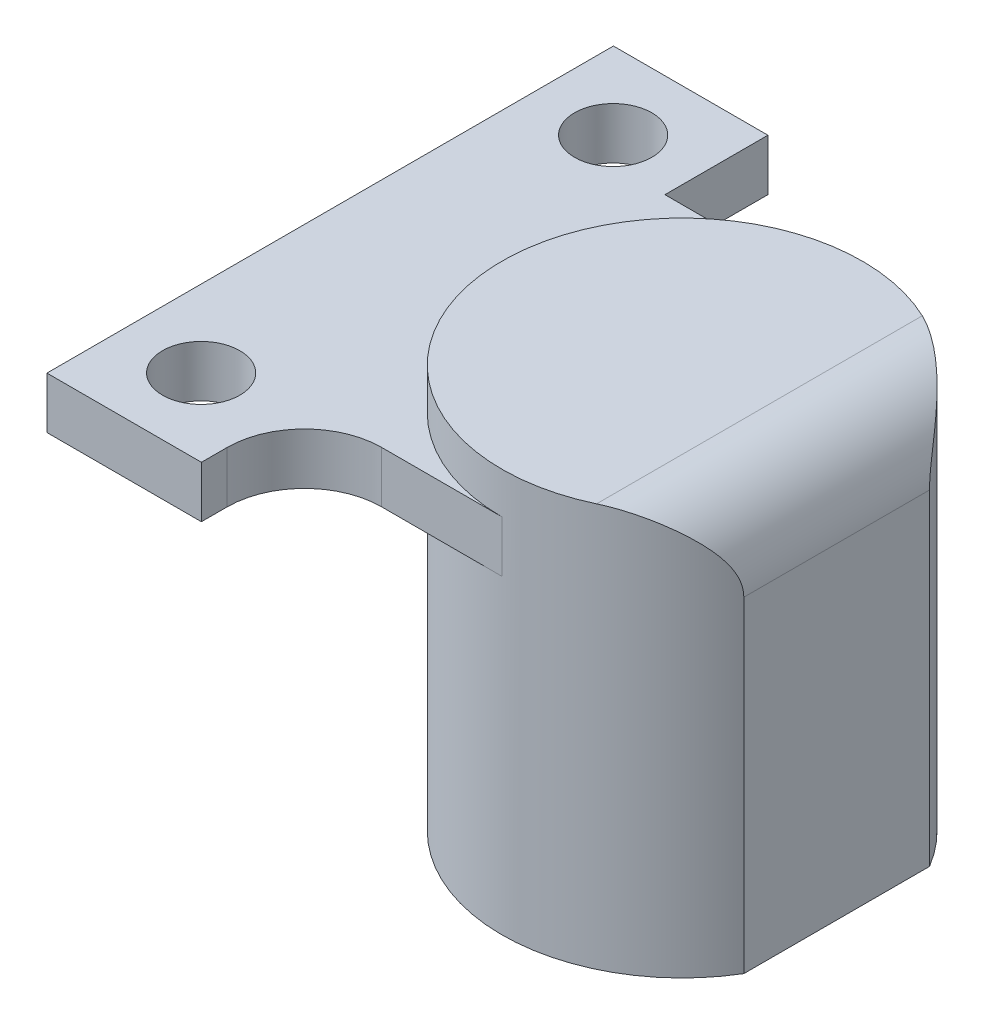
ISO-10303-21;
HEADER;
FILE_DESCRIPTION(('STEP AP214'),'2;1');
FILE_NAME('part.step','',(''),(''),'','','');
FILE_SCHEMA(('AUTOMOTIVE_DESIGN { 1 0 10303 214 1 1 1 1 }'));
ENDSEC;
DATA;
#1=APPLICATION_CONTEXT('core data for automotive mechanical design processes');
#2=APPLICATION_PROTOCOL_DEFINITION('international standard','automotive_design',2000,#1);
#3=PRODUCT_CONTEXT('',#1,'mechanical');
#4=PRODUCT('Part','Part','',(#3));
#5=PRODUCT_RELATED_PRODUCT_CATEGORY('part','',(#4));
#6=PRODUCT_DEFINITION_FORMATION('','',#4);
#7=PRODUCT_DEFINITION_CONTEXT('part definition',#1,'design');
#8=PRODUCT_DEFINITION('design','',#6,#7);
#9=PRODUCT_DEFINITION_SHAPE('','',#8);
#10=(LENGTH_UNIT() NAMED_UNIT(*) SI_UNIT(.MILLI.,.METRE.));
#11=(NAMED_UNIT(*) PLANE_ANGLE_UNIT() SI_UNIT($,.RADIAN.));
#12=(NAMED_UNIT(*) SI_UNIT($,.STERADIAN.) SOLID_ANGLE_UNIT());
#13=UNCERTAINTY_MEASURE_WITH_UNIT(LENGTH_MEASURE(1.E-05),#10,'distance_accuracy_value','');
#14=(GEOMETRIC_REPRESENTATION_CONTEXT(3) GLOBAL_UNCERTAINTY_ASSIGNED_CONTEXT((#13)) GLOBAL_UNIT_ASSIGNED_CONTEXT((#10,
#11,#12)) REPRESENTATION_CONTEXT('',''));
#15=CARTESIAN_POINT('',(0.,0.,0.));
#16=DIRECTION('',(0.,0.,1.));
#17=DIRECTION('',(1.,0.,0.));
#18=AXIS2_PLACEMENT_3D('',#15,#16,#17);
#19=CARTESIAN_POINT('',(3.00000000000001,12.66,-3.60555127546398));
#20=DIRECTION('',(0.,0.,-1.));
#21=DIRECTION('',(-1.,0.,0.));
#22=AXIS2_PLACEMENT_3D('',#19,#20,#21);
#23=CYLINDRICAL_SURFACE('',#22,3.);
#24=DIRECTION('',(0.,0.,1.));
#25=VECTOR('',#24,1.);
#26=CARTESIAN_POINT('',(6.00000000000002,12.66,-3.60555127546396));
#27=LINE('',#26,#25);
#28=CARTESIAN_POINT('',(6.00000000000002,12.66,-3.60555127546396));
#29=VERTEX_POINT('',#28);
#30=CARTESIAN_POINT('',(5.99999999999999,12.66,3.60555127546401));
#31=VERTEX_POINT('',#30);
#32=EDGE_CURVE('E173',#29,#31,#27,.T.);
#33=ORIENTED_EDGE('',*,*,#32,.F.);
#34=CARTESIAN_POINT('',(3.00000000000003,15.66,-6.32455532033675));
#35=CARTESIAN_POINT('',(3.09493653043601,15.6600046677572,-6.27954539564103));
#36=CARTESIAN_POINT('',(3.18878959130431,15.6554951840768,-6.23238730411597));
#37=CARTESIAN_POINT('',(3.3735772382066,15.6380919790941,-6.134315643579));
#38=CARTESIAN_POINT('',(3.46451523908464,15.6252084745325,-6.08340671779952));
#39=CARTESIAN_POINT('',(3.64220443721596,15.591839265947,-5.97870486558365));
#40=CARTESIAN_POINT('',(3.72898443678594,15.5714184758462,-5.92493982691222));
#41=CARTESIAN_POINT('',(3.89876515233543,15.5235647516884,-5.81462729508478));
#42=CARTESIAN_POINT('',(3.98176470137991,15.496129669538,-5.75807895384713));
#43=CARTESIAN_POINT('',(4.22375842258161,15.4044619441375,-5.58559691418396));
#44=CARTESIAN_POINT('',(4.37676935493854,15.3306630882142,-5.46621741916642));
#45=CARTESIAN_POINT('',(4.66576505836573,15.1606989396906,-5.22174647657742));
#46=CARTESIAN_POINT('',(4.80167971609713,15.0644458866592,-5.09663420591057));
#47=CARTESIAN_POINT('',(5.00461536945894,14.8941421508697,-4.89544307212083));
#48=CARTESIAN_POINT('',(5.07749680412401,14.8265430259163,-4.81970552571313));
#49=CARTESIAN_POINT('',(5.21656775729613,14.68404279828,-4.66882622569923));
#50=CARTESIAN_POINT('',(5.28275433322052,14.609138512935,-4.5936847473391));
#51=CARTESIAN_POINT('',(5.40799758497066,14.452097443981,-4.44555324562543));
#52=CARTESIAN_POINT('',(5.46707189913274,14.369979464197,-4.37255825397976));
#53=CARTESIAN_POINT('',(5.57782637693171,14.1979431659554,-4.23036114221015));
#54=CARTESIAN_POINT('',(5.62951346625119,14.1080322822817,-4.1611555075434));
#55=CARTESIAN_POINT('',(5.72301585438431,13.9231381242447,-4.03152950217135));
#56=CARTESIAN_POINT('',(5.76512858096801,13.8284713452523,-3.97087705211004));
#57=CARTESIAN_POINT('',(5.84066677543764,13.6304672895827,-3.85890673577066));
#58=CARTESIAN_POINT('',(5.8741020563137,13.527139983321,-3.80757834516448));
#59=CARTESIAN_POINT('',(5.92534256726129,13.3313176559775,-3.72722027291141));
#60=CARTESIAN_POINT('',(5.94488385845874,13.240265310895,-3.69583357672921));
#61=CARTESIAN_POINT('',(5.97558600517584,13.0534066209671,-3.64599167689169));
#62=CARTESIAN_POINT('',(5.98677280920469,12.957615989639,-3.62749644519796));
#63=CARTESIAN_POINT('',(5.99550866503187,12.8274882074117,-3.61301639017568));
#64=CARTESIAN_POINT('',(5.99718952397732,12.7940888866228,-3.61022470313571));
#65=CARTESIAN_POINT('',(5.9994353930432,12.7271313935653,-3.60649135061673));
#66=CARTESIAN_POINT('',(5.99999978771692,12.6935731438982,-3.60555070551907));
#67=CARTESIAN_POINT('',(6.00000000000002,12.66,-3.60555127546396));
#68=B_SPLINE_CURVE_WITH_KNOTS('',3,(#34,#35,#36,#37,#38,#39,#40,#41,#42,#43,#44,#45,#46,#47,#48,
#49,#50,#51,#52,#53,#54,#55,#56,#57,#58,#59,#60,#61,#62,#63,#64,#65,#66,#67),.UNSPECIFIED.,.F.,
.F.,(4,2,2,2,2,2,2,2,2,2,2,2,2,2,2,2,4),(0.,0.314987755355557,0.629591928816344,
0.941547537102512,1.25359879497099,1.87412118205294,2.49711071296859,2.87167897645952,
3.24641116454038,3.62019399283021,3.99362406006485,4.3530554451295,4.71207857426867,
5.00587307948295,5.2987512385273,5.39936845516224,5.50004112121761),.UNSPECIFIED.);
#69=CARTESIAN_POINT('',(3.00000000000003,15.66,-6.32455532033675));
#70=VERTEX_POINT('',#69);
#71=EDGE_CURVE('E11',#70,#29,#68,.T.);
#72=ORIENTED_EDGE('',*,*,#71,.F.);
#73=DIRECTION('',(0.,0.,1.));
#74=VECTOR('',#73,1.);
#75=CARTESIAN_POINT('',(3.00000000000001,15.66,-3.60555127546398));
#76=LINE('',#75,#74);
#77=CARTESIAN_POINT('',(2.99999999999997,15.66,6.32455532033677));
#78=VERTEX_POINT('',#77);
#79=EDGE_CURVE('E175',#78,#70,#76,.F.);
#80=ORIENTED_EDGE('',*,*,#79,.F.);
#81=CARTESIAN_POINT('',(5.99999999999999,12.66,3.60555127546401));
#82=CARTESIAN_POINT('',(6.00001070282223,12.7087497732982,3.60552478308489));
#83=CARTESIAN_POINT('',(5.99881214084997,12.7574826373458,3.6075278849052));
#84=CARTESIAN_POINT('',(5.99408162199084,12.8544495568724,3.6153869797712));
#85=CARTESIAN_POINT('',(5.99055326127023,12.9026842649262,3.62123703478625));
#86=CARTESIAN_POINT('',(5.98131258721386,12.997676486243,3.63647805156849));
#87=CARTESIAN_POINT('',(5.97563136583474,13.0444452162421,3.64581857794057));
#88=CARTESIAN_POINT('',(5.96221624542817,13.1369291206995,3.66771643756404));
#89=CARTESIAN_POINT('',(5.95448143875106,13.1826438195601,3.68027519313212));
#90=CARTESIAN_POINT('',(5.92265934395696,13.347731181071,3.73149003179929));
#91=CARTESIAN_POINT('',(5.89274746273465,13.463350271019,3.77884991397088));
#92=CARTESIAN_POINT('',(5.82189266332009,13.6850069398161,3.88712729712748));
#93=CARTESIAN_POINT('',(5.78087252440128,13.7909702293897,3.94813916570885));
#94=CARTESIAN_POINT('',(5.6973474079489,13.9763676471961,4.06751016473952));
#95=CARTESIAN_POINT('',(5.65624088133527,14.0572731430183,4.12460318543204));
#96=CARTESIAN_POINT('',(5.56829205146455,14.213024410379,4.2425863342132));
#97=CARTESIAN_POINT('',(5.52144597596116,14.2878661423297,4.30347894649676));
#98=CARTESIAN_POINT('',(5.4224247477594,14.4318606505696,4.4275973665208));
#99=CARTESIAN_POINT('',(5.37024900217347,14.5010127923844,4.49082343334058));
#100=CARTESIAN_POINT('',(5.260815025734,14.6338588922982,4.61853865378555));
#101=CARTESIAN_POINT('',(5.20355791822367,14.6975540506902,4.68302752579609));
#102=CARTESIAN_POINT('',(5.08022130490414,14.8235488832775,4.81665229639004));
#103=CARTESIAN_POINT('',(5.01381081128065,14.8854925723857,4.88581926027849));
#104=CARTESIAN_POINT('',(4.87547859132384,15.0032521067172,5.02387070075586));
#105=CARTESIAN_POINT('',(4.80355517691789,15.0590660621678,5.09275508396068));
#106=CARTESIAN_POINT('',(4.57971795814075,15.2169213749332,5.29783258406104));
#107=CARTESIAN_POINT('',(4.41959486605551,15.3095220210697,5.43260713284095));
#108=CARTESIAN_POINT('',(4.0934833939113,15.4588460497521,5.68170125324272));
#109=CARTESIAN_POINT('',(3.92919870693861,15.5179789273254,5.79678191110659));
#110=CARTESIAN_POINT('',(3.67191370674713,15.5851279070143,5.96048710071104));
#111=CARTESIAN_POINT('',(3.58443112107215,15.603911487536,6.01352310610383));
#112=CARTESIAN_POINT('',(3.40624684689613,15.6337364558233,6.11620985018356));
#113=CARTESIAN_POINT('',(3.31554755708179,15.6447834902715,6.16586303394968));
#114=CARTESIAN_POINT('',(3.18668558682459,15.654414518497,6.23271749545191));
#115=CARTESIAN_POINT('',(3.14959553548258,15.6565001995147,6.25154230461803));
#116=CARTESIAN_POINT('',(3.07505872312343,15.6592925309499,6.2885406042851));
#117=CARTESIAN_POINT('',(3.0376121059519,15.659999715612,6.30671434443014));
#118=CARTESIAN_POINT('',(2.99999999999998,15.66,6.32455532033677));
#119=B_SPLINE_CURVE_WITH_KNOTS('',3,(#81,#82,#83,#84,#85,#86,#87,#88,#89,#90,#91,#92,#93,#94,
#95,#96,#97,#98,#99,#100,#101,#102,#103,#104,#105,#106,#107,#108,#109,#110,#111,#112,#113,#114,
#115,#116,#117,#118),.UNSPECIFIED.,.F.,.F.,(4,2,2,2,2,2,2,2,2,2,2,2,2,2,2,2,2,2,4),(0.,
0.146166225733025,0.292107362008318,0.436016507923602,0.579989365417853,0.963057331576762,
1.34885982567561,1.67006905983176,1.99149054874022,2.31294783250362,2.63433422748046,
2.97648307579034,3.3187371128607,4.00248050624863,4.62711545307778,4.93883788920374,
5.25033257029745,5.37524714255534,5.50011329378779),.UNSPECIFIED.);
#120=EDGE_CURVE('E50',#31,#78,#119,.T.);
#121=ORIENTED_EDGE('',*,*,#120,.F.);
#122=EDGE_LOOP('',(#33,#72,#80,#121));
#123=FACE_BOUND('',#122,.T.);
#124=ADVANCED_FACE('F37',(#123),#23,.T.);
#125=CARTESIAN_POINT('',(0.,15.66,0.));
#126=DIRECTION('',(0.,-1.,0.));
#127=DIRECTION('',(0.,0.,-1.));
#128=AXIS2_PLACEMENT_3D('',#125,#126,#127);
#129=CYLINDRICAL_SURFACE('',#128,5.2);
#130=CARTESIAN_POINT('',(0.,0.,0.));
#131=DIRECTION('',(0.,1.,0.));
#132=DIRECTION('',(0.,0.,1.));
#133=AXIS2_PLACEMENT_3D('',#130,#131,#132);
#134=CIRCLE('',#133,5.2);
#135=CARTESIAN_POINT('',(0.,0.,5.2));
#136=VERTEX_POINT('',#135);
#137=EDGE_CURVE('E147',#136,#136,#134,.T.);
#138=ORIENTED_EDGE('',*,*,#137,.F.);
#139=EDGE_LOOP('',(#138));
#140=FACE_BOUND('',#139,.T.);
#141=CARTESIAN_POINT('',(0.,14.66,0.));
#142=DIRECTION('',(0.,1.,0.));
#143=DIRECTION('',(0.,0.,1.));
#144=AXIS2_PLACEMENT_3D('',#141,#142,#143);
#145=CIRCLE('',#144,5.2);
#146=CARTESIAN_POINT('',(0.,14.66,5.2));
#147=VERTEX_POINT('',#146);
#148=EDGE_CURVE('E136',#147,#147,#145,.T.);
#149=ORIENTED_EDGE('',*,*,#148,.T.);
#150=EDGE_LOOP('',(#149));
#151=FACE_BOUND('',#150,.T.);
#152=ADVANCED_FACE('F189',(#140,#151),#129,.F.);
#153=CARTESIAN_POINT('',(-4.67,12.06,10.));
#154=DIRECTION('',(0.,-1.,0.));
#155=DIRECTION('',(0.,0.,-1.));
#156=AXIS2_PLACEMENT_3D('',#153,#154,#155);
#157=CYLINDRICAL_SURFACE('',#156,3.);
#158=DIRECTION('',(0.,-1.,0.));
#159=VECTOR('',#158,1.);
#160=CARTESIAN_POINT('',(-4.67,12.06,7.));
#161=LINE('',#160,#159);
#162=CARTESIAN_POINT('',(-4.67,14.06,7.));
#163=VERTEX_POINT('',#162);
#164=CARTESIAN_POINT('',(-4.67,12.06,7.));
#165=VERTEX_POINT('',#164);
#166=EDGE_CURVE('E150',#163,#165,#161,.T.);
#167=ORIENTED_EDGE('',*,*,#166,.F.);
#168=CARTESIAN_POINT('',(-4.67,14.06,10.));
#169=DIRECTION('',(0.,1.,0.));
#170=DIRECTION('',(0.,0.,1.));
#171=AXIS2_PLACEMENT_3D('',#168,#169,#170);
#172=CIRCLE('',#171,3.);
#173=CARTESIAN_POINT('',(-7.67,14.06,10.));
#174=VERTEX_POINT('',#173);
#175=EDGE_CURVE('E169',#163,#174,#172,.T.);
#176=ORIENTED_EDGE('',*,*,#175,.T.);
#177=DIRECTION('',(0.,-1.,0.));
#178=VECTOR('',#177,1.);
#179=CARTESIAN_POINT('',(-7.67,12.06,10.));
#180=LINE('',#179,#178);
#181=CARTESIAN_POINT('',(-7.67,12.06,10.));
#182=VERTEX_POINT('',#181);
#183=EDGE_CURVE('E166',#182,#174,#180,.F.);
#184=ORIENTED_EDGE('',*,*,#183,.F.);
#185=CARTESIAN_POINT('',(-4.67,12.06,10.));
#186=DIRECTION('',(0.,1.,0.));
#187=DIRECTION('',(0.,0.,1.));
#188=AXIS2_PLACEMENT_3D('',#185,#186,#187);
#189=CIRCLE('',#188,3.);
#190=EDGE_CURVE('E171',#182,#165,#189,.F.);
#191=ORIENTED_EDGE('',*,*,#190,.T.);
#192=EDGE_LOOP('',(#167,#176,#184,#191));
#193=FACE_BOUND('',#192,.T.);
#194=ADVANCED_FACE('F185',(#193),#157,.F.);
#195=CARTESIAN_POINT('',(0.,12.06,0.));
#196=DIRECTION('',(0.,1.,0.));
#197=DIRECTION('',(0.,0.,1.));
#198=AXIS2_PLACEMENT_3D('',#195,#196,#197);
#199=PLANE('',#198);
#200=ORIENTED_EDGE('',*,*,#190,.F.);
#201=DIRECTION('',(0.,0.,1.));
#202=VECTOR('',#201,1.);
#203=CARTESIAN_POINT('',(-7.67,12.06,0.));
#204=LINE('',#203,#202);
#205=CARTESIAN_POINT('',(-7.67,12.06,11.));
#206=VERTEX_POINT('',#205);
#207=EDGE_CURVE('E234',#182,#206,#204,.T.);
#208=ORIENTED_EDGE('',*,*,#207,.T.);
#209=DIRECTION('',(1.,0.,0.));
#210=VECTOR('',#209,1.);
#211=CARTESIAN_POINT('',(0.,12.06,11.));
#212=LINE('',#211,#210);
#213=CARTESIAN_POINT('',(-13.67,12.06,11.));
#214=VERTEX_POINT('',#213);
#215=EDGE_CURVE('E247',#214,#206,#212,.T.);
#216=ORIENTED_EDGE('',*,*,#215,.F.);
#217=DIRECTION('',(0.,0.,1.));
#218=VECTOR('',#217,1.);
#219=CARTESIAN_POINT('',(-13.67,12.06,0.));
#220=LINE('',#219,#218);
#221=CARTESIAN_POINT('',(-13.67,12.06,-11.));
#222=VERTEX_POINT('',#221);
#223=EDGE_CURVE('E244',#222,#214,#220,.T.);
#224=ORIENTED_EDGE('',*,*,#223,.F.);
#225=DIRECTION('',(1.,0.,0.));
#226=VECTOR('',#225,1.);
#227=CARTESIAN_POINT('',(-13.67,12.06,-11.));
#228=LINE('',#227,#226);
#229=CARTESIAN_POINT('',(-7.67,12.06,-11.));
#230=VERTEX_POINT('',#229);
#231=EDGE_CURVE('E233',#222,#230,#228,.T.);
#232=ORIENTED_EDGE('',*,*,#231,.T.);
#233=DIRECTION('',(0.,0.,-1.));
#234=VECTOR('',#233,1.);
#235=CARTESIAN_POINT('',(-7.67,12.06,-7.));
#236=LINE('',#235,#234);
#237=CARTESIAN_POINT('',(-7.67,12.06,-7.));
#238=VERTEX_POINT('',#237);
#239=EDGE_CURVE('E265',#238,#230,#236,.T.);
#240=ORIENTED_EDGE('',*,*,#239,.F.);
#241=DIRECTION('',(1.,0.,0.));
#242=VECTOR('',#241,1.);
#243=CARTESIAN_POINT('',(0.,12.06,-7.));
#244=LINE('',#243,#242);
#245=CARTESIAN_POINT('',(0.,12.06,-7.));
#246=VERTEX_POINT('',#245);
#247=EDGE_CURVE('E242',#238,#246,#244,.T.);
#248=ORIENTED_EDGE('',*,*,#247,.T.);
#249=CARTESIAN_POINT('',(0.,12.06,0.));
#250=DIRECTION('',(0.,1.,0.));
#251=DIRECTION('',(0.,0.,1.));
#252=AXIS2_PLACEMENT_3D('',#249,#250,#251);
#253=CIRCLE('',#252,7.);
#254=CARTESIAN_POINT('',(0.,12.06,7.));
#255=VERTEX_POINT('',#254);
#256=EDGE_CURVE('E239',#246,#255,#253,.T.);
#257=ORIENTED_EDGE('',*,*,#256,.T.);
#258=DIRECTION('',(1.,0.,0.));
#259=VECTOR('',#258,1.);
#260=CARTESIAN_POINT('',(0.,12.06,7.));
#261=LINE('',#260,#259);
#262=EDGE_CURVE('E236',#165,#255,#261,.T.);
#263=ORIENTED_EDGE('',*,*,#262,.F.);
#264=EDGE_LOOP('',(#200,#208,#216,#224,#232,#240,#248,#257,#263));
#265=FACE_BOUND('',#264,.T.);
#266=CARTESIAN_POINT('',(-10.68,12.06,8.));
#267=DIRECTION('',(0.,-1.,0.));
#268=DIRECTION('',(0.,0.,-1.));
#269=AXIS2_PLACEMENT_3D('',#266,#267,#268);
#270=CIRCLE('',#269,1.5);
#271=CARTESIAN_POINT('',(-10.68,12.06,6.5));
#272=VERTEX_POINT('',#271);
#273=EDGE_CURVE('E208',#272,#272,#270,.T.);
#274=ORIENTED_EDGE('',*,*,#273,.F.);
#275=EDGE_LOOP('',(#274));
#276=FACE_BOUND('',#275,.T.);
#277=CARTESIAN_POINT('',(-10.68,12.06,-8.00000000000001));
#278=DIRECTION('',(0.,-1.,0.));
#279=DIRECTION('',(0.,0.,-1.));
#280=AXIS2_PLACEMENT_3D('',#277,#278,#279);
#281=CIRCLE('',#280,1.5);
#282=CARTESIAN_POINT('',(-10.68,12.06,-9.50000000000001));
#283=VERTEX_POINT('',#282);
#284=EDGE_CURVE('E160',#283,#283,#281,.F.);
#285=ORIENTED_EDGE('',*,*,#284,.T.);
#286=EDGE_LOOP('',(#285));
#287=FACE_BOUND('',#286,.T.);
#288=ADVANCED_FACE('F188',(#265,#276,#287),#199,.F.);
#289=CARTESIAN_POINT('',(0.,14.06,0.));
#290=DIRECTION('',(0.,1.,0.));
#291=DIRECTION('',(0.,0.,1.));
#292=AXIS2_PLACEMENT_3D('',#289,#290,#291);
#293=PLANE('',#292);
#294=ORIENTED_EDGE('',*,*,#175,.F.);
#295=DIRECTION('',(1.,0.,0.));
#296=VECTOR('',#295,1.);
#297=CARTESIAN_POINT('',(0.,14.06,7.));
#298=LINE('',#297,#296);
#299=CARTESIAN_POINT('',(0.,14.06,7.));
#300=VERTEX_POINT('',#299);
#301=EDGE_CURVE('E228',#163,#300,#298,.T.);
#302=ORIENTED_EDGE('',*,*,#301,.T.);
#303=CARTESIAN_POINT('',(0.,14.06,0.));
#304=DIRECTION('',(0.,1.,0.));
#305=DIRECTION('',(0.,0.,1.));
#306=AXIS2_PLACEMENT_3D('',#303,#304,#305);
#307=CIRCLE('',#306,7.);
#308=CARTESIAN_POINT('',(0.,14.06,-7.));
#309=VERTEX_POINT('',#308);
#310=EDGE_CURVE('E230',#309,#300,#307,.T.);
#311=ORIENTED_EDGE('',*,*,#310,.F.);
#312=DIRECTION('',(1.,0.,0.));
#313=VECTOR('',#312,1.);
#314=CARTESIAN_POINT('',(0.,14.06,-7.));
#315=LINE('',#314,#313);
#316=CARTESIAN_POINT('',(-7.67,14.06,-7.));
#317=VERTEX_POINT('',#316);
#318=EDGE_CURVE('E163',#317,#309,#315,.T.);
#319=ORIENTED_EDGE('',*,*,#318,.F.);
#320=DIRECTION('',(0.,0.,-1.));
#321=VECTOR('',#320,1.);
#322=CARTESIAN_POINT('',(-7.67,14.06,0.));
#323=LINE('',#322,#321);
#324=CARTESIAN_POINT('',(-7.67,14.06,-11.));
#325=VERTEX_POINT('',#324);
#326=EDGE_CURVE('E215',#317,#325,#323,.T.);
#327=ORIENTED_EDGE('',*,*,#326,.T.);
#328=DIRECTION('',(1.,0.,0.));
#329=VECTOR('',#328,1.);
#330=CARTESIAN_POINT('',(0.,14.06,-11.));
#331=LINE('',#330,#329);
#332=CARTESIAN_POINT('',(-13.67,14.06,-11.));
#333=VERTEX_POINT('',#332);
#334=EDGE_CURVE('E217',#333,#325,#331,.T.);
#335=ORIENTED_EDGE('',*,*,#334,.F.);
#336=DIRECTION('',(0.,0.,-1.));
#337=VECTOR('',#336,1.);
#338=CARTESIAN_POINT('',(-13.67,14.06,0.));
#339=LINE('',#338,#337);
#340=CARTESIAN_POINT('',(-13.67,14.06,11.));
#341=VERTEX_POINT('',#340);
#342=EDGE_CURVE('E220',#341,#333,#339,.T.);
#343=ORIENTED_EDGE('',*,*,#342,.F.);
#344=DIRECTION('',(1.,0.,0.));
#345=VECTOR('',#344,1.);
#346=CARTESIAN_POINT('',(0.,14.06,11.));
#347=LINE('',#346,#345);
#348=CARTESIAN_POINT('',(-7.67,14.06,11.));
#349=VERTEX_POINT('',#348);
#350=EDGE_CURVE('E223',#341,#349,#347,.T.);
#351=ORIENTED_EDGE('',*,*,#350,.T.);
#352=DIRECTION('',(0.,0.,1.));
#353=VECTOR('',#352,1.);
#354=CARTESIAN_POINT('',(-7.67,14.06,0.));
#355=LINE('',#354,#353);
#356=EDGE_CURVE('E226',#174,#349,#355,.T.);
#357=ORIENTED_EDGE('',*,*,#356,.F.);
#358=EDGE_LOOP('',(#294,#302,#311,#319,#327,#335,#343,#351,#357));
#359=FACE_BOUND('',#358,.T.);
#360=CARTESIAN_POINT('',(-10.68,14.06,8.));
#361=DIRECTION('',(0.,1.,0.));
#362=DIRECTION('',(0.,0.,1.));
#363=AXIS2_PLACEMENT_3D('',#360,#361,#362);
#364=CIRCLE('',#363,1.5);
#365=CARTESIAN_POINT('',(-10.68,14.06,9.50000000000001));
#366=VERTEX_POINT('',#365);
#367=EDGE_CURVE('E156',#366,#366,#364,.T.);
#368=ORIENTED_EDGE('',*,*,#367,.F.);
#369=EDGE_LOOP('',(#368));
#370=FACE_BOUND('',#369,.T.);
#371=CARTESIAN_POINT('',(-10.68,14.06,-8.00000000000001));
#372=DIRECTION('',(0.,1.,0.));
#373=DIRECTION('',(0.,0.,1.));
#374=AXIS2_PLACEMENT_3D('',#371,#372,#373);
#375=CIRCLE('',#374,1.5);
#376=CARTESIAN_POINT('',(-10.68,14.06,-6.50000000000001));
#377=VERTEX_POINT('',#376);
#378=EDGE_CURVE('E159',#377,#377,#375,.F.);
#379=ORIENTED_EDGE('',*,*,#378,.T.);
#380=EDGE_LOOP('',(#379));
#381=FACE_BOUND('',#380,.T.);
#382=ADVANCED_FACE('F195',(#359,#370,#381),#293,.T.);
#383=CARTESIAN_POINT('',(0.,15.66,0.));
#384=DIRECTION('',(0.,1.,0.));
#385=DIRECTION('',(0.,0.,1.));
#386=AXIS2_PLACEMENT_3D('',#383,#384,#385);
#387=PLANE('',#386);
#388=CARTESIAN_POINT('',(0.,15.66,0.));
#389=DIRECTION('',(0.,1.,0.));
#390=DIRECTION('',(0.,0.,1.));
#391=AXIS2_PLACEMENT_3D('',#388,#389,#390);
#392=CIRCLE('',#391,7.);
#393=EDGE_CURVE('E146',#70,#78,#392,.T.);
#394=ORIENTED_EDGE('',*,*,#393,.T.);
#395=ORIENTED_EDGE('',*,*,#79,.T.);
#396=EDGE_LOOP('',(#394,#395));
#397=FACE_BOUND('',#396,.T.);
#398=ADVANCED_FACE('F327',(#397),#387,.T.);
#399=CARTESIAN_POINT('',(-7.67,12.06,0.));
#400=DIRECTION('',(-1.,0.,0.));
#401=DIRECTION('',(0.,0.,1.));
#402=AXIS2_PLACEMENT_3D('',#399,#400,#401);
#403=PLANE('',#402);
#404=ORIENTED_EDGE('',*,*,#207,.F.);
#405=ORIENTED_EDGE('',*,*,#183,.T.);
#406=ORIENTED_EDGE('',*,*,#356,.T.);
#407=DIRECTION('',(0.,1.,0.));
#408=VECTOR('',#407,1.);
#409=CARTESIAN_POINT('',(-7.67,12.06,11.));
#410=LINE('',#409,#408);
#411=EDGE_CURVE('E251',#206,#349,#410,.T.);
#412=ORIENTED_EDGE('',*,*,#411,.F.);
#413=EDGE_LOOP('',(#404,#405,#406,#412));
#414=FACE_BOUND('',#413,.T.);
#415=ADVANCED_FACE('F289',(#414),#403,.F.);
#416=CARTESIAN_POINT('',(0.,12.06,11.));
#417=DIRECTION('',(0.,0.,1.));
#418=DIRECTION('',(1.,0.,0.));
#419=AXIS2_PLACEMENT_3D('',#416,#417,#418);
#420=PLANE('',#419);
#421=ORIENTED_EDGE('',*,*,#411,.T.);
#422=ORIENTED_EDGE('',*,*,#350,.F.);
#423=DIRECTION('',(0.,1.,0.));
#424=VECTOR('',#423,1.);
#425=CARTESIAN_POINT('',(-13.67,12.06,11.));
#426=LINE('',#425,#424);
#427=EDGE_CURVE('E254',#214,#341,#426,.T.);
#428=ORIENTED_EDGE('',*,*,#427,.F.);
#429=ORIENTED_EDGE('',*,*,#215,.T.);
#430=EDGE_LOOP('',(#421,#422,#428,#429));
#431=FACE_BOUND('',#430,.T.);
#432=ADVANCED_FACE('F285',(#431),#420,.T.);
#433=CARTESIAN_POINT('',(-13.67,12.06,0.));
#434=DIRECTION('',(-1.,0.,0.));
#435=DIRECTION('',(0.,0.,1.));
#436=AXIS2_PLACEMENT_3D('',#433,#434,#435);
#437=PLANE('',#436);
#438=ORIENTED_EDGE('',*,*,#427,.T.);
#439=ORIENTED_EDGE('',*,*,#342,.T.);
#440=DIRECTION('',(0.,1.,0.));
#441=VECTOR('',#440,1.);
#442=CARTESIAN_POINT('',(-13.67,12.06,-11.));
#443=LINE('',#442,#441);
#444=EDGE_CURVE('E237',#222,#333,#443,.T.);
#445=ORIENTED_EDGE('',*,*,#444,.F.);
#446=ORIENTED_EDGE('',*,*,#223,.T.);
#447=EDGE_LOOP('',(#438,#439,#445,#446));
#448=FACE_BOUND('',#447,.T.);
#449=ADVANCED_FACE('F278',(#448),#437,.T.);
#450=CARTESIAN_POINT('',(0.,12.06,-7.));
#451=DIRECTION('',(0.,0.,1.));
#452=DIRECTION('',(1.,0.,0.));
#453=AXIS2_PLACEMENT_3D('',#450,#451,#452);
#454=PLANE('',#453);
#455=ORIENTED_EDGE('',*,*,#318,.T.);
#456=DIRECTION('',(0.,1.,0.));
#457=VECTOR('',#456,1.);
#458=CARTESIAN_POINT('',(0.,12.06,-7.));
#459=LINE('',#458,#457);
#460=EDGE_CURVE('E257',#246,#309,#459,.T.);
#461=ORIENTED_EDGE('',*,*,#460,.F.);
#462=ORIENTED_EDGE('',*,*,#247,.F.);
#463=DIRECTION('',(0.,1.,0.));
#464=VECTOR('',#463,1.);
#465=CARTESIAN_POINT('',(-7.67,12.06,-7.));
#466=LINE('',#465,#464);
#467=EDGE_CURVE('E153',#238,#317,#466,.T.);
#468=ORIENTED_EDGE('',*,*,#467,.T.);
#469=EDGE_LOOP('',(#455,#461,#462,#468));
#470=FACE_BOUND('',#469,.T.);
#471=ADVANCED_FACE('F300',(#470),#454,.F.);
#472=CARTESIAN_POINT('',(0.,12.06,7.));
#473=DIRECTION('',(0.,0.,1.));
#474=DIRECTION('',(1.,0.,0.));
#475=AXIS2_PLACEMENT_3D('',#472,#473,#474);
#476=PLANE('',#475);
#477=ORIENTED_EDGE('',*,*,#301,.F.);
#478=ORIENTED_EDGE('',*,*,#166,.T.);
#479=ORIENTED_EDGE('',*,*,#262,.T.);
#480=DIRECTION('',(0.,1.,0.));
#481=VECTOR('',#480,1.);
#482=CARTESIAN_POINT('',(0.,12.06,7.));
#483=LINE('',#482,#481);
#484=EDGE_CURVE('E250',#255,#300,#483,.T.);
#485=ORIENTED_EDGE('',*,*,#484,.T.);
#486=EDGE_LOOP('',(#477,#478,#479,#485));
#487=FACE_BOUND('',#486,.T.);
#488=ADVANCED_FACE('F294',(#487),#476,.T.);
#489=CARTESIAN_POINT('',(-13.67,12.06,-11.));
#490=DIRECTION('',(0.,0.,1.));
#491=DIRECTION('',(1.,0.,0.));
#492=AXIS2_PLACEMENT_3D('',#489,#490,#491);
#493=PLANE('',#492);
#494=ORIENTED_EDGE('',*,*,#334,.T.);
#495=DIRECTION('',(0.,1.,0.));
#496=VECTOR('',#495,1.);
#497=CARTESIAN_POINT('',(-7.67,12.06,-11.));
#498=LINE('',#497,#496);
#499=EDGE_CURVE('E268',#230,#325,#498,.T.);
#500=ORIENTED_EDGE('',*,*,#499,.F.);
#501=ORIENTED_EDGE('',*,*,#231,.F.);
#502=ORIENTED_EDGE('',*,*,#444,.T.);
#503=EDGE_LOOP('',(#494,#500,#501,#502));
#504=FACE_BOUND('',#503,.T.);
#505=ADVANCED_FACE('F275',(#504),#493,.F.);
#506=CARTESIAN_POINT('',(-7.67,12.06,-7.));
#507=DIRECTION('',(1.,0.,0.));
#508=DIRECTION('',(0.,0.,-1.));
#509=AXIS2_PLACEMENT_3D('',#506,#507,#508);
#510=PLANE('',#509);
#511=ORIENTED_EDGE('',*,*,#499,.T.);
#512=ORIENTED_EDGE('',*,*,#326,.F.);
#513=ORIENTED_EDGE('',*,*,#467,.F.);
#514=ORIENTED_EDGE('',*,*,#239,.T.);
#515=EDGE_LOOP('',(#511,#512,#513,#514));
#516=FACE_BOUND('',#515,.T.);
#517=ADVANCED_FACE('F183',(#516),#510,.T.);
#518=CARTESIAN_POINT('',(0.,15.66,0.));
#519=DIRECTION('',(0.,-1.,0.));
#520=DIRECTION('',(0.,0.,-1.));
#521=AXIS2_PLACEMENT_3D('',#518,#519,#520);
#522=CYLINDRICAL_SURFACE('',#521,7.);
#523=ORIENTED_EDGE('',*,*,#393,.F.);
#524=ORIENTED_EDGE('',*,*,#71,.T.);
#525=DIRECTION('',(0.,-1.,0.));
#526=VECTOR('',#525,1.);
#527=CARTESIAN_POINT('',(6.00000000000002,15.661,-3.60555127546396));
#528=LINE('',#527,#526);
#529=CARTESIAN_POINT('',(6.00000000000002,0.,-3.60555127546396));
#530=VERTEX_POINT('',#529);
#531=EDGE_CURVE('E128',#29,#530,#528,.T.);
#532=ORIENTED_EDGE('',*,*,#531,.T.);
#533=CARTESIAN_POINT('',(0.,0.,0.));
#534=DIRECTION('',(0.,1.,0.));
#535=DIRECTION('',(0.,0.,1.));
#536=AXIS2_PLACEMENT_3D('',#533,#534,#535);
#537=CIRCLE('',#536,7.);
#538=CARTESIAN_POINT('',(5.99999999999999,0.,3.60555127546401));
#539=VERTEX_POINT('',#538);
#540=EDGE_CURVE('E133',#530,#539,#537,.T.);
#541=ORIENTED_EDGE('',*,*,#540,.T.);
#542=DIRECTION('',(0.,-1.,0.));
#543=VECTOR('',#542,1.);
#544=CARTESIAN_POINT('',(5.99999999999999,15.661,3.60555127546401));
#545=LINE('',#544,#543);
#546=EDGE_CURVE('E137',#31,#539,#545,.T.);
#547=ORIENTED_EDGE('',*,*,#546,.F.);
#548=ORIENTED_EDGE('',*,*,#120,.T.);
#549=EDGE_LOOP('',(#523,#524,#532,#541,#547,#548));
#550=FACE_BOUND('',#549,.T.);
#551=ORIENTED_EDGE('',*,*,#460,.T.);
#552=ORIENTED_EDGE('',*,*,#310,.T.);
#553=ORIENTED_EDGE('',*,*,#484,.F.);
#554=ORIENTED_EDGE('',*,*,#256,.F.);
#555=EDGE_LOOP('',(#551,#552,#553,#554));
#556=FACE_BOUND('',#555,.T.);
#557=ADVANCED_FACE('F130',(#550,#556),#522,.T.);
#558=CARTESIAN_POINT('',(0.,0.,0.));
#559=DIRECTION('',(0.,1.,0.));
#560=DIRECTION('',(0.,0.,1.));
#561=AXIS2_PLACEMENT_3D('',#558,#559,#560);
#562=PLANE('',#561);
#563=ORIENTED_EDGE('',*,*,#540,.F.);
#564=DIRECTION('',(0.,0.,-1.));
#565=VECTOR('',#564,1.);
#566=CARTESIAN_POINT('',(6.00000000000002,0.,-3.60555127546396));
#567=LINE('',#566,#565);
#568=EDGE_CURVE('E140',#539,#530,#567,.T.);
#569=ORIENTED_EDGE('',*,*,#568,.F.);
#570=EDGE_LOOP('',(#563,#569));
#571=FACE_BOUND('',#570,.T.);
#572=ORIENTED_EDGE('',*,*,#137,.T.);
#573=EDGE_LOOP('',(#572));
#574=FACE_BOUND('',#573,.T.);
#575=ADVANCED_FACE('F144',(#571,#574),#562,.F.);
#576=CARTESIAN_POINT('',(-10.68,22.06,8.));
#577=DIRECTION('',(0.,-1.,0.));
#578=DIRECTION('',(0.,0.,-1.));
#579=AXIS2_PLACEMENT_3D('',#576,#577,#578);
#580=CYLINDRICAL_SURFACE('',#579,1.5);
#581=ORIENTED_EDGE('',*,*,#367,.T.);
#582=EDGE_LOOP('',(#581));
#583=FACE_BOUND('',#582,.T.);
#584=ORIENTED_EDGE('',*,*,#273,.T.);
#585=EDGE_LOOP('',(#584));
#586=FACE_BOUND('',#585,.T.);
#587=ADVANCED_FACE('F312',(#583,#586),#580,.F.);
#588=CARTESIAN_POINT('',(-10.68,22.06,-8.00000000000001));
#589=DIRECTION('',(0.,-1.,0.));
#590=DIRECTION('',(0.,0.,-1.));
#591=AXIS2_PLACEMENT_3D('',#588,#589,#590);
#592=CYLINDRICAL_SURFACE('',#591,1.5);
#593=ORIENTED_EDGE('',*,*,#378,.F.);
#594=EDGE_LOOP('',(#593));
#595=FACE_BOUND('',#594,.T.);
#596=ORIENTED_EDGE('',*,*,#284,.F.);
#597=EDGE_LOOP('',(#596));
#598=FACE_BOUND('',#597,.T.);
#599=ADVANCED_FACE('F309',(#595,#598),#592,.F.);
#600=CARTESIAN_POINT('',(0.,14.66,0.));
#601=DIRECTION('',(0.,1.,0.));
#602=DIRECTION('',(0.,0.,1.));
#603=AXIS2_PLACEMENT_3D('',#600,#601,#602);
#604=PLANE('',#603);
#605=ORIENTED_EDGE('',*,*,#148,.F.);
#606=EDGE_LOOP('',(#605));
#607=FACE_BOUND('',#606,.T.);
#608=ADVANCED_FACE('F311',(#607),#604,.F.);
#609=CARTESIAN_POINT('',(6.00000000000002,15.661,-3.60555127546396));
#610=DIRECTION('',(-1.,0.,0.));
#611=DIRECTION('',(0.,0.,1.));
#612=AXIS2_PLACEMENT_3D('',#609,#610,#611);
#613=PLANE('',#612);
#614=ORIENTED_EDGE('',*,*,#531,.F.);
#615=ORIENTED_EDGE('',*,*,#32,.T.);
#616=ORIENTED_EDGE('',*,*,#546,.T.);
#617=ORIENTED_EDGE('',*,*,#568,.T.);
#618=EDGE_LOOP('',(#614,#615,#616,#617));
#619=FACE_BOUND('',#618,.T.);
#620=ADVANCED_FACE('F141',(#619),#613,.F.);
#621=CLOSED_SHELL('',(#124,#152,#194,#288,#382,#398,#415,#432,#449,#471,#488,#505,#517,#557,
#575,#587,#599,#608,#620));
#622=MANIFOLD_SOLID_BREP('B2',#621);
#623=ADVANCED_BREP_SHAPE_REPRESENTATION('',(#18,#622),#14);
#624=SHAPE_DEFINITION_REPRESENTATION(#9,#623);
ENDSEC;
END-ISO-10303-21;
